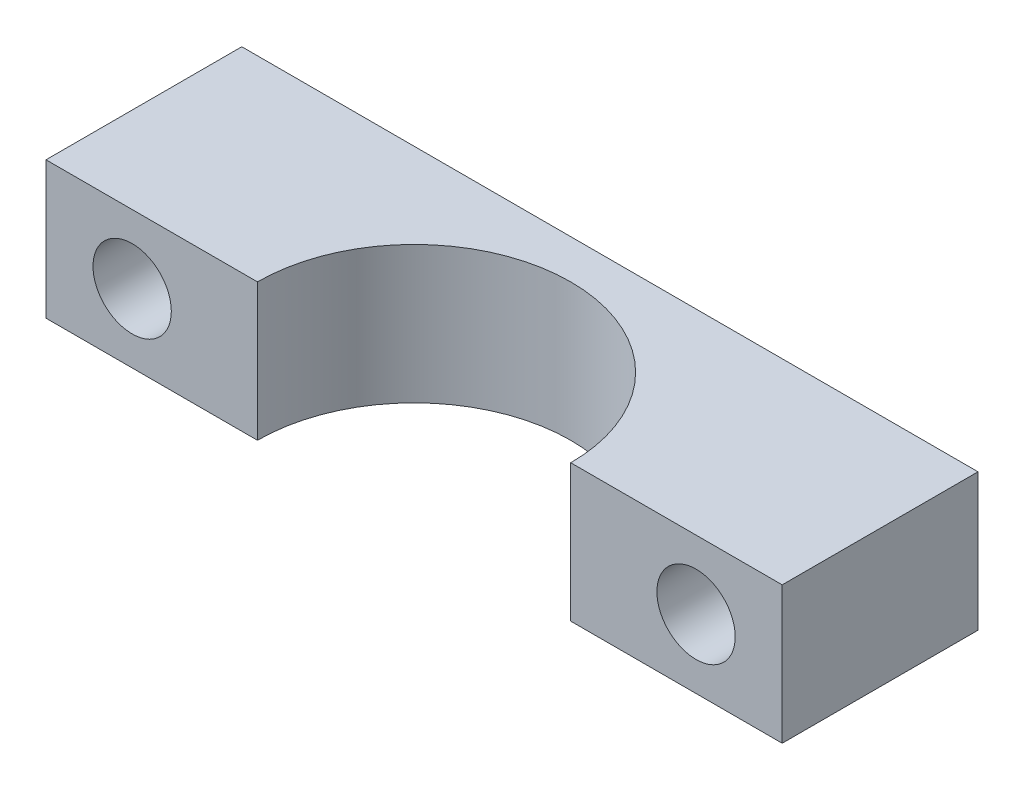
ISO-10303-21;
HEADER;
FILE_DESCRIPTION(('STEP AP214'),'2;1');
FILE_NAME('part.step','',(''),(''),'','','');
FILE_SCHEMA(('AUTOMOTIVE_DESIGN { 1 0 10303 214 1 1 1 1 }'));
ENDSEC;
DATA;
#1=APPLICATION_CONTEXT('core data for automotive mechanical design processes');
#2=APPLICATION_PROTOCOL_DEFINITION('international standard','automotive_design',2000,#1);
#3=PRODUCT_CONTEXT('',#1,'mechanical');
#4=PRODUCT('Part','Part','',(#3));
#5=PRODUCT_RELATED_PRODUCT_CATEGORY('part','',(#4));
#6=PRODUCT_DEFINITION_FORMATION('','',#4);
#7=PRODUCT_DEFINITION_CONTEXT('part definition',#1,'design');
#8=PRODUCT_DEFINITION('design','',#6,#7);
#9=PRODUCT_DEFINITION_SHAPE('','',#8);
#10=(LENGTH_UNIT() NAMED_UNIT(*) SI_UNIT(.MILLI.,.METRE.));
#11=(NAMED_UNIT(*) PLANE_ANGLE_UNIT() SI_UNIT($,.RADIAN.));
#12=(NAMED_UNIT(*) SI_UNIT($,.STERADIAN.) SOLID_ANGLE_UNIT());
#13=UNCERTAINTY_MEASURE_WITH_UNIT(LENGTH_MEASURE(1.E-05),#10,'distance_accuracy_value','');
#14=(GEOMETRIC_REPRESENTATION_CONTEXT(3) GLOBAL_UNCERTAINTY_ASSIGNED_CONTEXT((#13)) GLOBAL_UNIT_ASSIGNED_CONTEXT((#10,
#11,#12)) REPRESENTATION_CONTEXT('',''));
#15=CARTESIAN_POINT('',(0.,0.,0.));
#16=DIRECTION('',(0.,0.,1.));
#17=DIRECTION('',(1.,0.,0.));
#18=AXIS2_PLACEMENT_3D('',#15,#16,#17);
#19=CARTESIAN_POINT('',(0.,5.5626,0.));
#20=DIRECTION('',(0.,-1.,0.));
#21=DIRECTION('',(0.,0.,-1.));
#22=AXIS2_PLACEMENT_3D('',#19,#20,#21);
#23=CYLINDRICAL_SURFACE('',#22,12.7);
#24=CARTESIAN_POINT('',(0.,-5.5626,0.));
#25=DIRECTION('',(0.,-1.,0.));
#26=DIRECTION('',(0.,0.,-1.));
#27=AXIS2_PLACEMENT_3D('',#24,#25,#26);
#28=CIRCLE('',#27,12.7);
#29=CARTESIAN_POINT('',(-12.7,-5.5626,0.));
#30=VERTEX_POINT('',#29);
#31=CARTESIAN_POINT('',(12.7,-5.5626,0.));
#32=VERTEX_POINT('',#31);
#33=EDGE_CURVE('E125',#30,#32,#28,.T.);
#34=ORIENTED_EDGE('',*,*,#33,.T.);
#35=DIRECTION('',(0.,-1.,0.));
#36=VECTOR('',#35,1.);
#37=CARTESIAN_POINT('',(12.7,5.5626,0.));
#38=LINE('',#37,#36);
#39=CARTESIAN_POINT('',(12.7,5.5626,0.));
#40=VERTEX_POINT('',#39);
#41=EDGE_CURVE('E11',#40,#32,#38,.T.);
#42=ORIENTED_EDGE('',*,*,#41,.F.);
#43=CARTESIAN_POINT('',(0.,5.5626,0.));
#44=DIRECTION('',(0.,-1.,0.));
#45=DIRECTION('',(0.,0.,-1.));
#46=AXIS2_PLACEMENT_3D('',#43,#44,#45);
#47=CIRCLE('',#46,12.7);
#48=CARTESIAN_POINT('',(-12.7,5.5626,0.));
#49=VERTEX_POINT('',#48);
#50=EDGE_CURVE('E136',#49,#40,#47,.T.);
#51=ORIENTED_EDGE('',*,*,#50,.F.);
#52=DIRECTION('',(0.,-1.,0.));
#53=VECTOR('',#52,1.);
#54=CARTESIAN_POINT('',(-12.7,5.5626,0.));
#55=LINE('',#54,#53);
#56=EDGE_CURVE('E121',#49,#30,#55,.T.);
#57=ORIENTED_EDGE('',*,*,#56,.T.);
#58=EDGE_LOOP('',(#34,#42,#51,#57));
#59=FACE_BOUND('',#58,.T.);
#60=ADVANCED_FACE('F41',(#59),#23,.F.);
#61=CARTESIAN_POINT('',(29.845,5.5626,0.));
#62=DIRECTION('',(0.,0.,-1.));
#63=DIRECTION('',(-1.,0.,0.));
#64=AXIS2_PLACEMENT_3D('',#61,#62,#63);
#65=PLANE('',#64);
#66=CARTESIAN_POINT('',(22.86,0.,0.));
#67=DIRECTION('',(0.,0.,1.));
#68=DIRECTION('',(1.,0.,0.));
#69=AXIS2_PLACEMENT_3D('',#66,#67,#68);
#70=CIRCLE('',#69,3.175);
#71=CARTESIAN_POINT('',(26.035,0.,0.));
#72=VERTEX_POINT('',#71);
#73=EDGE_CURVE('E187',#72,#72,#70,.T.);
#74=ORIENTED_EDGE('',*,*,#73,.F.);
#75=EDGE_LOOP('',(#74));
#76=FACE_BOUND('',#75,.T.);
#77=DIRECTION('',(1.,0.,0.));
#78=VECTOR('',#77,1.);
#79=CARTESIAN_POINT('',(29.845,-5.5626,0.));
#80=LINE('',#79,#78);
#81=CARTESIAN_POINT('',(29.845,-5.5626,0.));
#82=VERTEX_POINT('',#81);
#83=EDGE_CURVE('E128',#32,#82,#80,.T.);
#84=ORIENTED_EDGE('',*,*,#83,.T.);
#85=DIRECTION('',(0.,-1.,0.));
#86=VECTOR('',#85,1.);
#87=CARTESIAN_POINT('',(29.845,5.5626,0.));
#88=LINE('',#87,#86);
#89=CARTESIAN_POINT('',(29.845,5.5626,0.));
#90=VERTEX_POINT('',#89);
#91=EDGE_CURVE('E49',#90,#82,#88,.T.);
#92=ORIENTED_EDGE('',*,*,#91,.F.);
#93=DIRECTION('',(1.,0.,0.));
#94=VECTOR('',#93,1.);
#95=CARTESIAN_POINT('',(29.845,5.5626,0.));
#96=LINE('',#95,#94);
#97=EDGE_CURVE('E94',#40,#90,#96,.T.);
#98=ORIENTED_EDGE('',*,*,#97,.F.);
#99=ORIENTED_EDGE('',*,*,#41,.T.);
#100=EDGE_LOOP('',(#84,#92,#98,#99));
#101=FACE_BOUND('',#100,.T.);
#102=ADVANCED_FACE('F164',(#76,#101),#65,.F.);
#103=CARTESIAN_POINT('',(29.845,5.5626,-15.875));
#104=DIRECTION('',(-1.,0.,0.));
#105=DIRECTION('',(0.,0.,1.));
#106=AXIS2_PLACEMENT_3D('',#103,#104,#105);
#107=PLANE('',#106);
#108=DIRECTION('',(0.,0.,-1.));
#109=VECTOR('',#108,1.);
#110=CARTESIAN_POINT('',(29.845,-5.5626,-15.875));
#111=LINE('',#110,#109);
#112=CARTESIAN_POINT('',(29.845,-5.5626,-15.875));
#113=VERTEX_POINT('',#112);
#114=EDGE_CURVE('E131',#82,#113,#111,.T.);
#115=ORIENTED_EDGE('',*,*,#114,.T.);
#116=DIRECTION('',(0.,-1.,0.));
#117=VECTOR('',#116,1.);
#118=CARTESIAN_POINT('',(29.845,5.5626,-15.875));
#119=LINE('',#118,#117);
#120=CARTESIAN_POINT('',(29.845,5.5626,-15.875));
#121=VERTEX_POINT('',#120);
#122=EDGE_CURVE('E116',#121,#113,#119,.T.);
#123=ORIENTED_EDGE('',*,*,#122,.F.);
#124=DIRECTION('',(0.,0.,-1.));
#125=VECTOR('',#124,1.);
#126=CARTESIAN_POINT('',(29.845,5.5626,-15.875));
#127=LINE('',#126,#125);
#128=EDGE_CURVE('E107',#90,#121,#127,.T.);
#129=ORIENTED_EDGE('',*,*,#128,.F.);
#130=ORIENTED_EDGE('',*,*,#91,.T.);
#131=EDGE_LOOP('',(#115,#123,#129,#130));
#132=FACE_BOUND('',#131,.T.);
#133=ADVANCED_FACE('F142',(#132),#107,.F.);
#134=CARTESIAN_POINT('',(-29.845,5.5626,-15.875));
#135=DIRECTION('',(0.,0.,1.));
#136=DIRECTION('',(1.,0.,0.));
#137=AXIS2_PLACEMENT_3D('',#134,#135,#136);
#138=PLANE('',#137);
#139=CARTESIAN_POINT('',(-22.86,0.,-15.875));
#140=DIRECTION('',(0.,0.,1.));
#141=DIRECTION('',(1.,0.,0.));
#142=AXIS2_PLACEMENT_3D('',#139,#140,#141);
#143=CIRCLE('',#142,3.175);
#144=CARTESIAN_POINT('',(-19.685,0.,-15.875));
#145=VERTEX_POINT('',#144);
#146=EDGE_CURVE('E129',#145,#145,#143,.T.);
#147=ORIENTED_EDGE('',*,*,#146,.T.);
#148=EDGE_LOOP('',(#147));
#149=FACE_BOUND('',#148,.T.);
#150=CARTESIAN_POINT('',(22.86,0.,-15.875));
#151=DIRECTION('',(0.,0.,1.));
#152=DIRECTION('',(1.,0.,0.));
#153=AXIS2_PLACEMENT_3D('',#150,#151,#152);
#154=CIRCLE('',#153,3.175);
#155=CARTESIAN_POINT('',(26.035,0.,-15.875));
#156=VERTEX_POINT('',#155);
#157=EDGE_CURVE('E184',#156,#156,#154,.T.);
#158=ORIENTED_EDGE('',*,*,#157,.T.);
#159=EDGE_LOOP('',(#158));
#160=FACE_BOUND('',#159,.T.);
#161=DIRECTION('',(-1.,0.,0.));
#162=VECTOR('',#161,1.);
#163=CARTESIAN_POINT('',(-29.845,-5.5626,-15.875));
#164=LINE('',#163,#162);
#165=CARTESIAN_POINT('',(-29.845,-5.5626,-15.875));
#166=VERTEX_POINT('',#165);
#167=EDGE_CURVE('E115',#113,#166,#164,.T.);
#168=ORIENTED_EDGE('',*,*,#167,.T.);
#169=DIRECTION('',(0.,-1.,0.));
#170=VECTOR('',#169,1.);
#171=CARTESIAN_POINT('',(-29.845,5.5626,-15.875));
#172=LINE('',#171,#170);
#173=CARTESIAN_POINT('',(-29.845,5.5626,-15.875));
#174=VERTEX_POINT('',#173);
#175=EDGE_CURVE('E112',#174,#166,#172,.T.);
#176=ORIENTED_EDGE('',*,*,#175,.F.);
#177=DIRECTION('',(-1.,0.,0.));
#178=VECTOR('',#177,1.);
#179=CARTESIAN_POINT('',(-29.845,5.5626,-15.875));
#180=LINE('',#179,#178);
#181=EDGE_CURVE('E101',#121,#174,#180,.T.);
#182=ORIENTED_EDGE('',*,*,#181,.F.);
#183=ORIENTED_EDGE('',*,*,#122,.T.);
#184=EDGE_LOOP('',(#168,#176,#182,#183));
#185=FACE_BOUND('',#184,.T.);
#186=ADVANCED_FACE('F113',(#149,#160,#185),#138,.F.);
#187=CARTESIAN_POINT('',(-29.845,5.5626,0.));
#188=DIRECTION('',(1.,0.,0.));
#189=DIRECTION('',(0.,0.,-1.));
#190=AXIS2_PLACEMENT_3D('',#187,#188,#189);
#191=PLANE('',#190);
#192=DIRECTION('',(0.,0.,1.));
#193=VECTOR('',#192,1.);
#194=CARTESIAN_POINT('',(-29.845,-5.5626,0.));
#195=LINE('',#194,#193);
#196=CARTESIAN_POINT('',(-29.845,-5.5626,0.));
#197=VERTEX_POINT('',#196);
#198=EDGE_CURVE('E80',#166,#197,#195,.T.);
#199=ORIENTED_EDGE('',*,*,#198,.T.);
#200=DIRECTION('',(0.,-1.,0.));
#201=VECTOR('',#200,1.);
#202=CARTESIAN_POINT('',(-29.845,5.5626,0.));
#203=LINE('',#202,#201);
#204=CARTESIAN_POINT('',(-29.845,5.5626,0.));
#205=VERTEX_POINT('',#204);
#206=EDGE_CURVE('E117',#205,#197,#203,.T.);
#207=ORIENTED_EDGE('',*,*,#206,.F.);
#208=DIRECTION('',(0.,0.,1.));
#209=VECTOR('',#208,1.);
#210=CARTESIAN_POINT('',(-29.845,5.5626,0.));
#211=LINE('',#210,#209);
#212=EDGE_CURVE('E105',#174,#205,#211,.T.);
#213=ORIENTED_EDGE('',*,*,#212,.F.);
#214=ORIENTED_EDGE('',*,*,#175,.T.);
#215=EDGE_LOOP('',(#199,#207,#213,#214));
#216=FACE_BOUND('',#215,.T.);
#217=ADVANCED_FACE('F119',(#216),#191,.F.);
#218=CARTESIAN_POINT('',(-12.7,5.5626,0.));
#219=DIRECTION('',(0.,0.,-1.));
#220=DIRECTION('',(-1.,0.,0.));
#221=AXIS2_PLACEMENT_3D('',#218,#219,#220);
#222=PLANE('',#221);
#223=CARTESIAN_POINT('',(-22.86,0.,0.));
#224=DIRECTION('',(0.,0.,1.));
#225=DIRECTION('',(1.,0.,0.));
#226=AXIS2_PLACEMENT_3D('',#223,#224,#225);
#227=CIRCLE('',#226,3.175);
#228=CARTESIAN_POINT('',(-19.685,0.,0.));
#229=VERTEX_POINT('',#228);
#230=EDGE_CURVE('E186',#229,#229,#227,.T.);
#231=ORIENTED_EDGE('',*,*,#230,.F.);
#232=EDGE_LOOP('',(#231));
#233=FACE_BOUND('',#232,.T.);
#234=DIRECTION('',(1.,0.,0.));
#235=VECTOR('',#234,1.);
#236=CARTESIAN_POINT('',(-12.7,-5.5626,0.));
#237=LINE('',#236,#235);
#238=EDGE_CURVE('E86',#197,#30,#237,.T.);
#239=ORIENTED_EDGE('',*,*,#238,.T.);
#240=ORIENTED_EDGE('',*,*,#56,.F.);
#241=DIRECTION('',(1.,0.,0.));
#242=VECTOR('',#241,1.);
#243=CARTESIAN_POINT('',(-12.7,5.5626,0.));
#244=LINE('',#243,#242);
#245=EDGE_CURVE('E57',#205,#49,#244,.T.);
#246=ORIENTED_EDGE('',*,*,#245,.F.);
#247=ORIENTED_EDGE('',*,*,#206,.T.);
#248=EDGE_LOOP('',(#239,#240,#246,#247));
#249=FACE_BOUND('',#248,.T.);
#250=ADVANCED_FACE('F149',(#233,#249),#222,.F.);
#251=CARTESIAN_POINT('',(0.,5.5626,0.));
#252=DIRECTION('',(0.,-1.,0.));
#253=DIRECTION('',(0.,0.,-1.));
#254=AXIS2_PLACEMENT_3D('',#251,#252,#253);
#255=PLANE('',#254);
#256=ORIENTED_EDGE('',*,*,#50,.T.);
#257=ORIENTED_EDGE('',*,*,#97,.T.);
#258=ORIENTED_EDGE('',*,*,#128,.T.);
#259=ORIENTED_EDGE('',*,*,#181,.T.);
#260=ORIENTED_EDGE('',*,*,#212,.T.);
#261=ORIENTED_EDGE('',*,*,#245,.T.);
#262=EDGE_LOOP('',(#256,#257,#258,#259,#260,#261));
#263=FACE_BOUND('',#262,.T.);
#264=ADVANCED_FACE('F103',(#263),#255,.F.);
#265=CARTESIAN_POINT('',(0.,-5.5626,0.));
#266=DIRECTION('',(0.,-1.,0.));
#267=DIRECTION('',(0.,0.,-1.));
#268=AXIS2_PLACEMENT_3D('',#265,#266,#267);
#269=PLANE('',#268);
#270=ORIENTED_EDGE('',*,*,#33,.F.);
#271=ORIENTED_EDGE('',*,*,#238,.F.);
#272=ORIENTED_EDGE('',*,*,#198,.F.);
#273=ORIENTED_EDGE('',*,*,#167,.F.);
#274=ORIENTED_EDGE('',*,*,#114,.F.);
#275=ORIENTED_EDGE('',*,*,#83,.F.);
#276=EDGE_LOOP('',(#270,#271,#272,#273,#274,#275));
#277=FACE_BOUND('',#276,.T.);
#278=ADVANCED_FACE('F145',(#277),#269,.T.);
#279=CARTESIAN_POINT('',(-22.86,0.,-15.875));
#280=DIRECTION('',(0.,0.,1.));
#281=DIRECTION('',(1.,0.,0.));
#282=AXIS2_PLACEMENT_3D('',#279,#280,#281);
#283=CYLINDRICAL_SURFACE('',#282,3.175);
#284=ORIENTED_EDGE('',*,*,#146,.F.);
#285=EDGE_LOOP('',(#284));
#286=FACE_BOUND('',#285,.T.);
#287=ORIENTED_EDGE('',*,*,#230,.T.);
#288=EDGE_LOOP('',(#287));
#289=FACE_BOUND('',#288,.T.);
#290=ADVANCED_FACE('F199',(#286,#289),#283,.F.);
#291=CARTESIAN_POINT('',(22.86,0.,-15.875));
#292=DIRECTION('',(0.,0.,1.));
#293=DIRECTION('',(1.,0.,0.));
#294=AXIS2_PLACEMENT_3D('',#291,#292,#293);
#295=CYLINDRICAL_SURFACE('',#294,3.175);
#296=ORIENTED_EDGE('',*,*,#157,.F.);
#297=EDGE_LOOP('',(#296));
#298=FACE_BOUND('',#297,.T.);
#299=ORIENTED_EDGE('',*,*,#73,.T.);
#300=EDGE_LOOP('',(#299));
#301=FACE_BOUND('',#300,.T.);
#302=ADVANCED_FACE('F197',(#298,#301),#295,.F.);
#303=CLOSED_SHELL('',(#60,#102,#133,#186,#217,#250,#264,#278,#290,#302));
#304=MANIFOLD_SOLID_BREP('B2',#303);
#305=ADVANCED_BREP_SHAPE_REPRESENTATION('',(#18,#304),#14);
#306=SHAPE_DEFINITION_REPRESENTATION(#9,#305);
ENDSEC;
END-ISO-10303-21;
